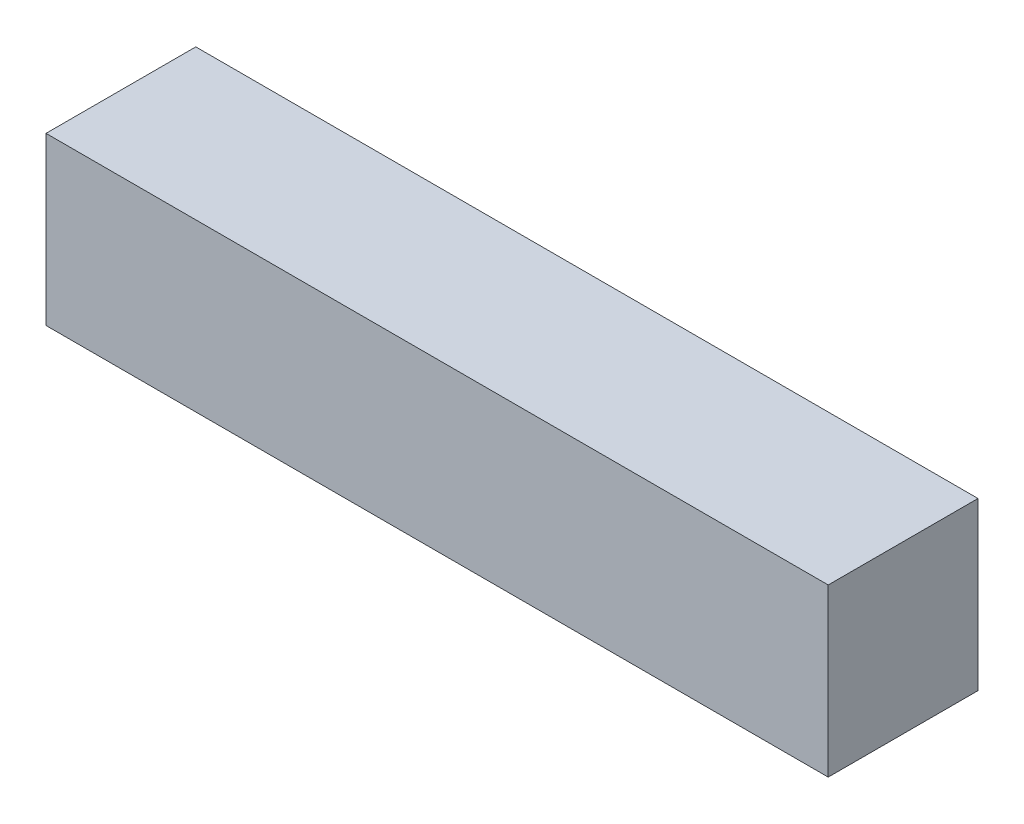
ISO-10303-21;
HEADER;
FILE_DESCRIPTION(('STEP AP214'),'2;1');
FILE_NAME('part.step','',(''),(''),'','','');
FILE_SCHEMA(('AUTOMOTIVE_DESIGN { 1 0 10303 214 1 1 1 1 }'));
ENDSEC;
DATA;
#1=APPLICATION_CONTEXT('core data for automotive mechanical design processes');
#2=APPLICATION_PROTOCOL_DEFINITION('international standard','automotive_design',2000,#1);
#3=PRODUCT_CONTEXT('',#1,'mechanical');
#4=PRODUCT('Part','Part','',(#3));
#5=PRODUCT_RELATED_PRODUCT_CATEGORY('part','',(#4));
#6=PRODUCT_DEFINITION_FORMATION('','',#4);
#7=PRODUCT_DEFINITION_CONTEXT('part definition',#1,'design');
#8=PRODUCT_DEFINITION('design','',#6,#7);
#9=PRODUCT_DEFINITION_SHAPE('','',#8);
#10=(LENGTH_UNIT() NAMED_UNIT(*) SI_UNIT(.MILLI.,.METRE.));
#11=(NAMED_UNIT(*) PLANE_ANGLE_UNIT() SI_UNIT($,.RADIAN.));
#12=(NAMED_UNIT(*) SI_UNIT($,.STERADIAN.) SOLID_ANGLE_UNIT());
#13=UNCERTAINTY_MEASURE_WITH_UNIT(LENGTH_MEASURE(1.E-05),#10,'distance_accuracy_value','');
#14=(GEOMETRIC_REPRESENTATION_CONTEXT(3) GLOBAL_UNCERTAINTY_ASSIGNED_CONTEXT((#13)) GLOBAL_UNIT_ASSIGNED_CONTEXT((#10,
#11,#12)) REPRESENTATION_CONTEXT('',''));
#15=CARTESIAN_POINT('',(0.,0.,0.));
#16=DIRECTION('',(0.,0.,1.));
#17=DIRECTION('',(1.,0.,0.));
#18=AXIS2_PLACEMENT_3D('',#15,#16,#17);
#19=CARTESIAN_POINT('',(0.,10.,0.));
#20=DIRECTION('',(1.,0.,0.));
#21=DIRECTION('',(0.,0.,-1.));
#22=AXIS2_PLACEMENT_3D('',#19,#20,#21);
#23=PLANE('',#22);
#24=DIRECTION('',(0.,0.,1.));
#25=VECTOR('',#24,1.);
#26=CARTESIAN_POINT('',(0.,0.,0.));
#27=LINE('',#26,#25);
#28=CARTESIAN_POINT('',(0.,0.,-9.));
#29=VERTEX_POINT('',#28);
#30=CARTESIAN_POINT('',(0.,0.,0.));
#31=VERTEX_POINT('',#30);
#32=EDGE_CURVE('E107',#29,#31,#27,.T.);
#33=ORIENTED_EDGE('',*,*,#32,.T.);
#34=DIRECTION('',(0.,-1.,0.));
#35=VECTOR('',#34,1.);
#36=CARTESIAN_POINT('',(0.,10.,0.));
#37=LINE('',#36,#35);
#38=CARTESIAN_POINT('',(0.,10.,0.));
#39=VERTEX_POINT('',#38);
#40=EDGE_CURVE('E11',#39,#31,#37,.T.);
#41=ORIENTED_EDGE('',*,*,#40,.F.);
#42=DIRECTION('',(0.,0.,1.));
#43=VECTOR('',#42,1.);
#44=CARTESIAN_POINT('',(0.,10.,0.));
#45=LINE('',#44,#43);
#46=CARTESIAN_POINT('',(0.,10.,-9.));
#47=VERTEX_POINT('',#46);
#48=EDGE_CURVE('E91',#47,#39,#45,.T.);
#49=ORIENTED_EDGE('',*,*,#48,.F.);
#50=DIRECTION('',(0.,-1.,0.));
#51=VECTOR('',#50,1.);
#52=CARTESIAN_POINT('',(0.,10.,-9.));
#53=LINE('',#52,#51);
#54=EDGE_CURVE('E103',#47,#29,#53,.T.);
#55=ORIENTED_EDGE('',*,*,#54,.T.);
#56=EDGE_LOOP('',(#33,#41,#49,#55));
#57=FACE_BOUND('',#56,.T.);
#58=ADVANCED_FACE('F39',(#57),#23,.F.);
#59=CARTESIAN_POINT('',(0.,10.,0.));
#60=DIRECTION('',(0.,0.,-1.));
#61=DIRECTION('',(-1.,0.,0.));
#62=AXIS2_PLACEMENT_3D('',#59,#60,#61);
#63=PLANE('',#62);
#64=DIRECTION('',(1.,0.,0.));
#65=VECTOR('',#64,1.);
#66=CARTESIAN_POINT('',(0.,0.,0.));
#67=LINE('',#66,#65);
#68=CARTESIAN_POINT('',(47.,0.,0.));
#69=VERTEX_POINT('',#68);
#70=EDGE_CURVE('E96',#31,#69,#67,.T.);
#71=ORIENTED_EDGE('',*,*,#70,.T.);
#72=DIRECTION('',(0.,-1.,0.));
#73=VECTOR('',#72,1.);
#74=CARTESIAN_POINT('',(47.,10.,0.));
#75=LINE('',#74,#73);
#76=CARTESIAN_POINT('',(47.,10.,0.));
#77=VERTEX_POINT('',#76);
#78=EDGE_CURVE('E48',#77,#69,#75,.T.);
#79=ORIENTED_EDGE('',*,*,#78,.F.);
#80=DIRECTION('',(1.,0.,0.));
#81=VECTOR('',#80,1.);
#82=CARTESIAN_POINT('',(0.,10.,0.));
#83=LINE('',#82,#81);
#84=EDGE_CURVE('E86',#39,#77,#83,.T.);
#85=ORIENTED_EDGE('',*,*,#84,.F.);
#86=ORIENTED_EDGE('',*,*,#40,.T.);
#87=EDGE_LOOP('',(#71,#79,#85,#86));
#88=FACE_BOUND('',#87,.T.);
#89=ADVANCED_FACE('F95',(#88),#63,.F.);
#90=CARTESIAN_POINT('',(47.,10.,0.));
#91=DIRECTION('',(-1.,0.,0.));
#92=DIRECTION('',(0.,0.,1.));
#93=AXIS2_PLACEMENT_3D('',#90,#91,#92);
#94=PLANE('',#93);
#95=DIRECTION('',(0.,0.,-1.));
#96=VECTOR('',#95,1.);
#97=CARTESIAN_POINT('',(47.,0.,0.));
#98=LINE('',#97,#96);
#99=CARTESIAN_POINT('',(47.,0.,-9.));
#100=VERTEX_POINT('',#99);
#101=EDGE_CURVE('E73',#69,#100,#98,.T.);
#102=ORIENTED_EDGE('',*,*,#101,.T.);
#103=DIRECTION('',(0.,-1.,0.));
#104=VECTOR('',#103,1.);
#105=CARTESIAN_POINT('',(47.,10.,-9.));
#106=LINE('',#105,#104);
#107=CARTESIAN_POINT('',(47.,10.,-9.));
#108=VERTEX_POINT('',#107);
#109=EDGE_CURVE('E98',#108,#100,#106,.T.);
#110=ORIENTED_EDGE('',*,*,#109,.F.);
#111=DIRECTION('',(0.,0.,-1.));
#112=VECTOR('',#111,1.);
#113=CARTESIAN_POINT('',(47.,10.,0.));
#114=LINE('',#113,#112);
#115=EDGE_CURVE('E89',#77,#108,#114,.T.);
#116=ORIENTED_EDGE('',*,*,#115,.F.);
#117=ORIENTED_EDGE('',*,*,#78,.T.);
#118=EDGE_LOOP('',(#102,#110,#116,#117));
#119=FACE_BOUND('',#118,.T.);
#120=ADVANCED_FACE('F99',(#119),#94,.F.);
#121=CARTESIAN_POINT('',(0.,10.,-9.));
#122=DIRECTION('',(0.,0.,1.));
#123=DIRECTION('',(1.,0.,0.));
#124=AXIS2_PLACEMENT_3D('',#121,#122,#123);
#125=PLANE('',#124);
#126=DIRECTION('',(-1.,0.,0.));
#127=VECTOR('',#126,1.);
#128=CARTESIAN_POINT('',(0.,0.,-9.));
#129=LINE('',#128,#127);
#130=EDGE_CURVE('E79',#100,#29,#129,.T.);
#131=ORIENTED_EDGE('',*,*,#130,.T.);
#132=ORIENTED_EDGE('',*,*,#54,.F.);
#133=DIRECTION('',(-1.,0.,0.));
#134=VECTOR('',#133,1.);
#135=CARTESIAN_POINT('',(0.,10.,-9.));
#136=LINE('',#135,#134);
#137=EDGE_CURVE('E56',#108,#47,#136,.T.);
#138=ORIENTED_EDGE('',*,*,#137,.F.);
#139=ORIENTED_EDGE('',*,*,#109,.T.);
#140=EDGE_LOOP('',(#131,#132,#138,#139));
#141=FACE_BOUND('',#140,.T.);
#142=ADVANCED_FACE('F120',(#141),#125,.F.);
#143=CARTESIAN_POINT('',(0.,10.,0.));
#144=DIRECTION('',(0.,-1.,0.));
#145=DIRECTION('',(0.,0.,-1.));
#146=AXIS2_PLACEMENT_3D('',#143,#144,#145);
#147=PLANE('',#146);
#148=ORIENTED_EDGE('',*,*,#48,.T.);
#149=ORIENTED_EDGE('',*,*,#84,.T.);
#150=ORIENTED_EDGE('',*,*,#115,.T.);
#151=ORIENTED_EDGE('',*,*,#137,.T.);
#152=EDGE_LOOP('',(#148,#149,#150,#151));
#153=FACE_BOUND('',#152,.T.);
#154=ADVANCED_FACE('F87',(#153),#147,.F.);
#155=CARTESIAN_POINT('',(0.,0.,0.));
#156=DIRECTION('',(0.,-1.,0.));
#157=DIRECTION('',(0.,0.,-1.));
#158=AXIS2_PLACEMENT_3D('',#155,#156,#157);
#159=PLANE('',#158);
#160=ORIENTED_EDGE('',*,*,#32,.F.);
#161=ORIENTED_EDGE('',*,*,#130,.F.);
#162=ORIENTED_EDGE('',*,*,#101,.F.);
#163=ORIENTED_EDGE('',*,*,#70,.F.);
#164=EDGE_LOOP('',(#160,#161,#162,#163));
#165=FACE_BOUND('',#164,.T.);
#166=ADVANCED_FACE('F123',(#165),#159,.T.);
#167=CLOSED_SHELL('',(#58,#89,#120,#142,#154,#166));
#168=MANIFOLD_SOLID_BREP('B2',#167);
#169=ADVANCED_BREP_SHAPE_REPRESENTATION('',(#18,#168),#14);
#170=SHAPE_DEFINITION_REPRESENTATION(#9,#169);
ENDSEC;
END-ISO-10303-21;
